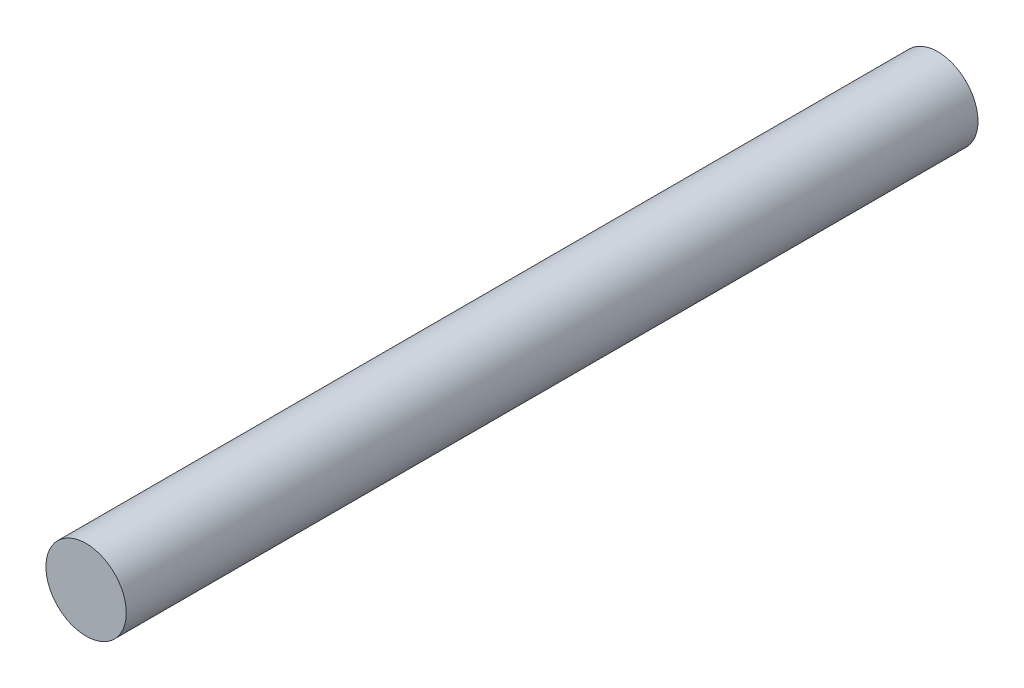
ISO-10303-21;
HEADER;
FILE_DESCRIPTION(('STEP AP214'),'2;1');
FILE_NAME('part.step','',(''),(''),'','','');
FILE_SCHEMA(('AUTOMOTIVE_DESIGN { 1 0 10303 214 1 1 1 1 }'));
ENDSEC;
DATA;
#1=APPLICATION_CONTEXT('core data for automotive mechanical design processes');
#2=APPLICATION_PROTOCOL_DEFINITION('international standard','automotive_design',2000,#1);
#3=PRODUCT_CONTEXT('',#1,'mechanical');
#4=PRODUCT('Part','Part','',(#3));
#5=PRODUCT_RELATED_PRODUCT_CATEGORY('part','',(#4));
#6=PRODUCT_DEFINITION_FORMATION('','',#4);
#7=PRODUCT_DEFINITION_CONTEXT('part definition',#1,'design');
#8=PRODUCT_DEFINITION('design','',#6,#7);
#9=PRODUCT_DEFINITION_SHAPE('','',#8);
#10=(LENGTH_UNIT() NAMED_UNIT(*) SI_UNIT(.MILLI.,.METRE.));
#11=(NAMED_UNIT(*) PLANE_ANGLE_UNIT() SI_UNIT($,.RADIAN.));
#12=(NAMED_UNIT(*) SI_UNIT($,.STERADIAN.) SOLID_ANGLE_UNIT());
#13=UNCERTAINTY_MEASURE_WITH_UNIT(LENGTH_MEASURE(1.E-05),#10,'distance_accuracy_value','');
#14=(GEOMETRIC_REPRESENTATION_CONTEXT(3) GLOBAL_UNCERTAINTY_ASSIGNED_CONTEXT((#13)) GLOBAL_UNIT_ASSIGNED_CONTEXT((#10,
#11,#12)) REPRESENTATION_CONTEXT('',''));
#15=CARTESIAN_POINT('',(0.,0.,0.));
#16=DIRECTION('',(0.,0.,1.));
#17=DIRECTION('',(1.,0.,0.));
#18=AXIS2_PLACEMENT_3D('',#15,#16,#17);
#19=CARTESIAN_POINT('',(0.,0.,53.));
#20=DIRECTION('',(0.,0.,-1.));
#21=DIRECTION('',(-1.,0.,0.));
#22=AXIS2_PLACEMENT_3D('',#19,#20,#21);
#23=CYLINDRICAL_SURFACE('',#22,2.5);
#24=CARTESIAN_POINT('',(0.,0.,53.));
#25=DIRECTION('',(0.,0.,1.));
#26=DIRECTION('',(1.,0.,0.));
#27=AXIS2_PLACEMENT_3D('',#24,#25,#26);
#28=CIRCLE('',#27,2.5);
#29=CARTESIAN_POINT('',(2.5,0.,53.));
#30=VERTEX_POINT('',#29);
#31=EDGE_CURVE('E10',#30,#30,#28,.T.);
#32=ORIENTED_EDGE('',*,*,#31,.F.);
#33=EDGE_LOOP('',(#32));
#34=FACE_BOUND('',#33,.T.);
#35=CARTESIAN_POINT('',(0.,0.,0.));
#36=DIRECTION('',(0.,0.,1.));
#37=DIRECTION('',(1.,0.,0.));
#38=AXIS2_PLACEMENT_3D('',#35,#36,#37);
#39=CIRCLE('',#38,2.5);
#40=CARTESIAN_POINT('',(2.5,0.,0.));
#41=VERTEX_POINT('',#40);
#42=EDGE_CURVE('E37',#41,#41,#39,.T.);
#43=ORIENTED_EDGE('',*,*,#42,.T.);
#44=EDGE_LOOP('',(#43));
#45=FACE_BOUND('',#44,.T.);
#46=ADVANCED_FACE('F40',(#34,#45),#23,.T.);
#47=CARTESIAN_POINT('',(0.,0.,53.));
#48=DIRECTION('',(0.,0.,1.));
#49=DIRECTION('',(1.,0.,0.));
#50=AXIS2_PLACEMENT_3D('',#47,#48,#49);
#51=PLANE('',#50);
#52=ORIENTED_EDGE('',*,*,#31,.T.);
#53=EDGE_LOOP('',(#52));
#54=FACE_BOUND('',#53,.T.);
#55=ADVANCED_FACE('F55',(#54),#51,.T.);
#56=CARTESIAN_POINT('',(0.,0.,0.));
#57=DIRECTION('',(0.,0.,1.));
#58=DIRECTION('',(1.,0.,0.));
#59=AXIS2_PLACEMENT_3D('',#56,#57,#58);
#60=PLANE('',#59);
#61=ORIENTED_EDGE('',*,*,#42,.F.);
#62=EDGE_LOOP('',(#61));
#63=FACE_BOUND('',#62,.T.);
#64=ADVANCED_FACE('F49',(#63),#60,.F.);
#65=CLOSED_SHELL('',(#46,#55,#64));
#66=MANIFOLD_SOLID_BREP('B2',#65);
#67=ADVANCED_BREP_SHAPE_REPRESENTATION('',(#18,#66),#14);
#68=SHAPE_DEFINITION_REPRESENTATION(#9,#67);
ENDSEC;
END-ISO-10303-21;
